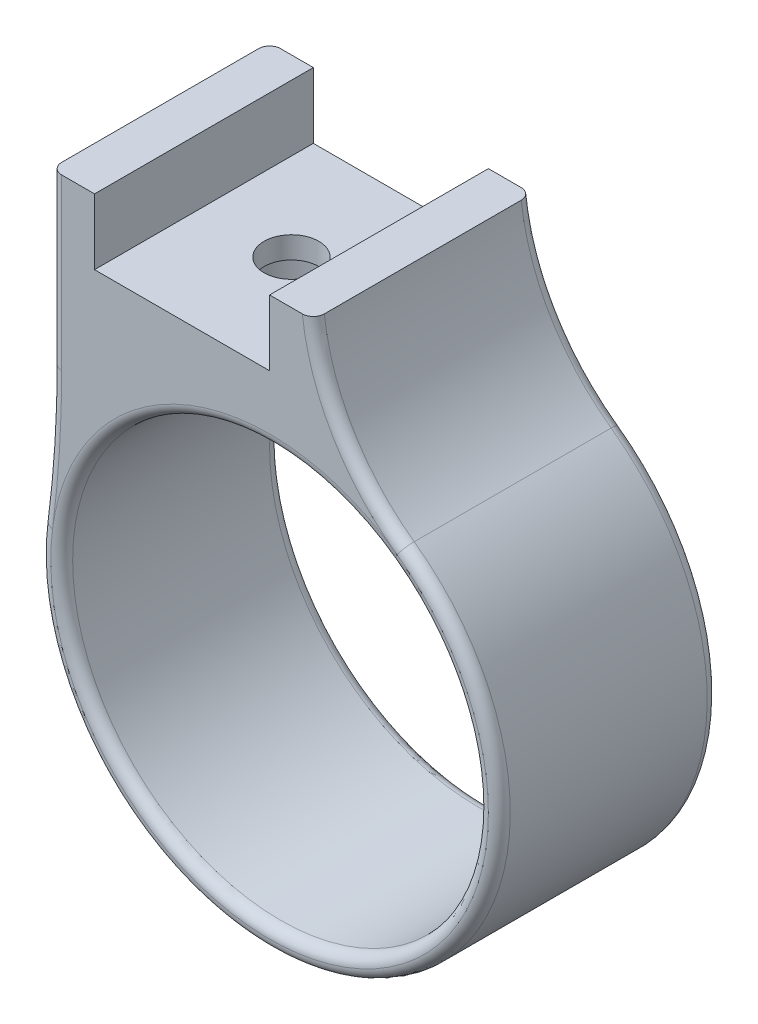
ISO-10303-21;
HEADER;
FILE_DESCRIPTION(('STEP AP214'),'2;1');
FILE_NAME('part.step','',(''),(''),'','','');
FILE_SCHEMA(('AUTOMOTIVE_DESIGN { 1 0 10303 214 1 1 1 1 }'));
ENDSEC;
DATA;
#1=APPLICATION_CONTEXT('core data for automotive mechanical design processes');
#2=APPLICATION_PROTOCOL_DEFINITION('international standard','automotive_design',2000,#1);
#3=PRODUCT_CONTEXT('',#1,'mechanical');
#4=PRODUCT('Part','Part','',(#3));
#5=PRODUCT_RELATED_PRODUCT_CATEGORY('part','',(#4));
#6=PRODUCT_DEFINITION_FORMATION('','',#4);
#7=PRODUCT_DEFINITION_CONTEXT('part definition',#1,'design');
#8=PRODUCT_DEFINITION('design','',#6,#7);
#9=PRODUCT_DEFINITION_SHAPE('','',#8);
#10=(LENGTH_UNIT() NAMED_UNIT(*) SI_UNIT(.MILLI.,.METRE.));
#11=(NAMED_UNIT(*) PLANE_ANGLE_UNIT() SI_UNIT($,.RADIAN.));
#12=(NAMED_UNIT(*) SI_UNIT($,.STERADIAN.) SOLID_ANGLE_UNIT());
#13=UNCERTAINTY_MEASURE_WITH_UNIT(LENGTH_MEASURE(1.E-05),#10,'distance_accuracy_value','');
#14=(GEOMETRIC_REPRESENTATION_CONTEXT(3) GLOBAL_UNCERTAINTY_ASSIGNED_CONTEXT((#13)) GLOBAL_UNIT_ASSIGNED_CONTEXT((#10,
#11,#12)) REPRESENTATION_CONTEXT('',''));
#15=CARTESIAN_POINT('',(0.,0.,0.));
#16=DIRECTION('',(0.,0.,1.));
#17=DIRECTION('',(1.,0.,0.));
#18=AXIS2_PLACEMENT_3D('',#15,#16,#17);
#19=CARTESIAN_POINT('',(0.,0.,10.));
#20=DIRECTION('',(0.,0.,-1.));
#21=DIRECTION('',(-1.,0.,0.));
#22=AXIS2_PLACEMENT_3D('',#19,#20,#21);
#23=CYLINDRICAL_SURFACE('',#22,9.5);
#24=CARTESIAN_POINT('',(0.,0.,9.5));
#25=DIRECTION('',(0.,0.,1.));
#26=DIRECTION('',(1.,0.,0.));
#27=AXIS2_PLACEMENT_3D('',#24,#25,#26);
#28=CIRCLE('',#27,9.5);
#29=CARTESIAN_POINT('',(9.5,0.,9.5));
#30=VERTEX_POINT('',#29);
#31=EDGE_CURVE('E55',#30,#30,#28,.T.);
#32=ORIENTED_EDGE('',*,*,#31,.T.);
#33=EDGE_LOOP('',(#32));
#34=FACE_BOUND('',#33,.T.);
#35=CARTESIAN_POINT('',(0.,0.,0.5));
#36=DIRECTION('',(0.,0.,1.));
#37=DIRECTION('',(1.,0.,0.));
#38=AXIS2_PLACEMENT_3D('',#35,#36,#37);
#39=CIRCLE('',#38,9.5);
#40=CARTESIAN_POINT('',(9.5,0.,0.5));
#41=VERTEX_POINT('',#40);
#42=EDGE_CURVE('E12',#41,#41,#39,.F.);
#43=ORIENTED_EDGE('',*,*,#42,.T.);
#44=EDGE_LOOP('',(#43));
#45=FACE_BOUND('',#44,.T.);
#46=CARTESIAN_POINT('',(-1.25,9.41740410091868,5.));
#47=CARTESIAN_POINT('',(-1.25000242942614,9.41740499517722,4.8471392243067));
#48=CARTESIAN_POINT('',(-1.2627801799666,9.41573453110463,4.69425180431218));
#49=CARTESIAN_POINT('',(-1.31352514631828,9.40878806358123,4.39276621787823));
#50=CARTESIAN_POINT('',(-1.35149964592117,9.40351101753854,4.24416930468956));
#51=CARTESIAN_POINT('',(-1.45149934047252,9.38859361920773,3.95550281859574));
#52=CARTESIAN_POINT('',(-1.51352756614653,9.37895271705608,3.81543432282976));
#53=CARTESIAN_POINT('',(-1.65967963332873,9.35419320402572,3.54788760394283));
#54=CARTESIAN_POINT('',(-1.74380079640655,9.33907525707058,3.42040785720493));
#55=CARTESIAN_POINT('',(-1.93092350382833,9.30218011409104,3.18224160698829));
#56=CARTESIAN_POINT('',(-2.0338335202413,9.28043487266991,3.07147825293275));
#57=CARTESIAN_POINT('',(-2.25527493712746,9.22911803105209,2.86905331392161));
#58=CARTESIAN_POINT('',(-2.37380473062673,9.19954723563895,2.77738976646479));
#59=CARTESIAN_POINT('',(-2.62192537839612,9.13191972864553,2.61561960292051));
#60=CARTESIAN_POINT('',(-2.7514759727179,9.09389314891011,2.545438494697));
#61=CARTESIAN_POINT('',(-3.01762299798536,9.00907614012515,2.4273276134396));
#62=CARTESIAN_POINT('',(-3.15421999503698,8.96228500613684,2.37939963131849));
#63=CARTESIAN_POINT('',(-3.43428005248692,8.85881723520026,2.30480448948951));
#64=CARTESIAN_POINT('',(-3.57782690233763,8.80189038542422,2.27880390405754));
#65=CARTESIAN_POINT('',(-3.86385602742951,8.68013910771712,2.24960747174418));
#66=CARTESIAN_POINT('',(-4.00633788213507,8.61531171860293,2.24642020237022));
#67=CARTESIAN_POINT('',(-4.29941272675105,8.4731257513436,2.26207068473277));
#68=CARTESIAN_POINT('',(-4.44960526553902,8.3951657645434,2.28288569143764));
#69=CARTESIAN_POINT('',(-4.74172530905777,8.23370798861784,2.34768868907996));
#70=CARTESIAN_POINT('',(-4.88365040665897,8.15020860163924,2.3916833918837));
#71=CARTESIAN_POINT('',(-5.17473347939294,7.96901420507636,2.5079810705976));
#72=CARTESIAN_POINT('',(-5.32244789450581,7.87088119269677,2.58321222201509));
#73=CARTESIAN_POINT('',(-5.60232462183589,7.67419344673526,2.75892282676735));
#74=CARTESIAN_POINT('',(-5.73445578215324,7.57563826333657,2.85945163603097));
#75=CARTESIAN_POINT('',(-5.92402033422029,7.42719331690365,3.0330702519432));
#76=CARTESIAN_POINT('',(-5.98800057109484,7.3756417307288,3.09771193215855));
#77=CARTESIAN_POINT('',(-6.11002804353712,7.274877156096,3.23402397066109));
#78=CARTESIAN_POINT('',(-6.1680734827941,7.225664878084,3.30569644420251));
#79=CARTESIAN_POINT('',(-6.3320478649435,7.08349099981838,3.53086284293945));
#80=CARTESIAN_POINT('',(-6.42845591791608,6.99547873205268,3.69508223965497));
#81=CARTESIAN_POINT('',(-6.55508932673793,6.87641414794421,3.97669687122736));
#82=CARTESIAN_POINT('',(-6.59624006673192,6.83680704450654,4.08566205520932));
#83=CARTESIAN_POINT('',(-6.66498491233125,6.76980576245483,4.31136824505659));
#84=CARTESIAN_POINT('',(-6.69259796013116,6.7423945241549,4.42809812500889));
#85=CARTESIAN_POINT('',(-6.73256732999249,6.70249065996649,4.66769936779907));
#86=CARTESIAN_POINT('',(-6.74480087448898,6.69011811651118,4.79061210716036));
#87=CARTESIAN_POINT('',(-6.75251262896919,6.68233596578608,5.03750346713367));
#88=CARTESIAN_POINT('',(-6.74799567700432,6.68692146051948,5.16148176965871));
#89=CARTESIAN_POINT('',(-6.72402945207496,6.71100941371279,5.39269228442336));
#90=CARTESIAN_POINT('',(-6.70624814322181,6.72884476725199,5.50028535620649));
#91=CARTESIAN_POINT('',(-6.65887545745454,6.77572746341205,5.71027185804691));
#92=CARTESIAN_POINT('',(-6.62927726321997,6.80478127779574,5.81266224810216));
#93=CARTESIAN_POINT('',(-6.54651684102347,6.88458549573622,6.04817921459132));
#94=CARTESIAN_POINT('',(-6.48867625637885,6.9393858242949,6.17828383109876));
#95=CARTESIAN_POINT('',(-6.356687317711,7.06049398701428,6.42410971956249));
#96=CARTESIAN_POINT('',(-6.28250219149629,7.12682769704027,6.53979762275179));
#97=CARTESIAN_POINT('',(-6.09602069372829,7.28751136757294,6.78889444149955));
#98=CARTESIAN_POINT('',(-5.97897151409784,7.384289006387,6.9171763927953));
#99=CARTESIAN_POINT('',(-5.72543648242841,7.5825688310675,7.14820937107058));
#100=CARTESIAN_POINT('',(-5.58893966870389,7.68407365955245,7.25094590907615));
#101=CARTESIAN_POINT('',(-5.29764456616094,7.88776912227569,7.43068143589357));
#102=CARTESIAN_POINT('',(-5.14266662756549,7.98995552620879,7.5073942664146));
#103=CARTESIAN_POINT('',(-4.81829029509524,8.18964079940366,7.63115105158259));
#104=CARTESIAN_POINT('',(-4.64889534411574,8.287140779166,7.67820206726441));
#105=CARTESIAN_POINT('',(-4.3859028570678,8.4275751472844,7.72427555804476));
#106=CARTESIAN_POINT('',(-4.29603713560976,8.4737455919423,7.73553909118393));
#107=CARTESIAN_POINT('',(-4.11434377817889,8.56343413119145,7.74912931418743));
#108=CARTESIAN_POINT('',(-4.02251716747022,8.60695356813883,7.75146056462163));
#109=CARTESIAN_POINT('',(-3.83775107481048,8.69091286545009,7.7467641521344));
#110=CARTESIAN_POINT('',(-3.74481214972662,8.73135419785879,7.73974099288959));
#111=CARTESIAN_POINT('',(-3.5587523743861,8.80882668049014,7.71598788876548));
#112=CARTESIAN_POINT('',(-3.46563156132805,8.84585846588441,7.69925975610261));
#113=CARTESIAN_POINT('',(-3.29229554848402,8.91169155828491,7.65866945548362));
#114=CARTESIAN_POINT('',(-3.21196696449857,8.94093813413205,7.63600781925485));
#115=CARTESIAN_POINT('',(-3.05282183959244,8.99652047184373,7.58309575378409));
#116=CARTESIAN_POINT('',(-2.97400507643748,9.02285666428044,7.55284644925895));
#117=CARTESIAN_POINT('',(-2.81876131443948,9.07255318495519,7.48482362876756));
#118=CARTESIAN_POINT('',(-2.74233298670707,9.09591519105757,7.44705438622973));
#119=CARTESIAN_POINT('',(-2.59270966428482,9.13969063683839,7.36418270269511));
#120=CARTESIAN_POINT('',(-2.51951439071886,9.16010433117786,7.31908089576621));
#121=CARTESIAN_POINT('',(-2.32168041620334,9.21286688326707,7.18385179033027));
#122=CARTESIAN_POINT('',(-2.20136112480906,9.24213300231458,7.08600956154516));
#123=CARTESIAN_POINT('',(-1.97815345982823,9.29247403007962,6.87049030343174));
#124=CARTESIAN_POINT('',(-1.8752624646644,9.31355017135803,6.75281626254127));
#125=CARTESIAN_POINT('',(-1.69370108656971,9.34824257297877,6.50539562121783));
#126=CARTESIAN_POINT('',(-1.61432077387448,9.3620899860072,6.37620180195469));
#127=CARTESIAN_POINT('',(-1.47775747425183,9.384617782292,6.10619705412071));
#128=CARTESIAN_POINT('',(-1.42056815666641,9.39329963955816,5.96538945265532));
#129=CARTESIAN_POINT('',(-1.33390304160166,9.40597969607959,5.6882690120222));
#130=CARTESIAN_POINT('',(-1.30250747252459,9.41030923767995,5.55256725796968));
#131=CARTESIAN_POINT('',(-1.26055454106607,9.41602107692763,5.27791774010017));
#132=CARTESIAN_POINT('',(-1.24999779134274,9.41740328792397,5.1389698809697));
#133=CARTESIAN_POINT('',(-1.25,9.41740410091868,5.));
#134=B_SPLINE_CURVE_WITH_KNOTS('',3,(#46,#47,#48,#49,#50,#51,#52,#53,#54,#55,#56,#57,#58,#59,
#60,#61,#62,#63,#64,#65,#66,#67,#68,#69,#70,#71,#72,#73,#74,#75,#76,#77,#78,#79,#80,#81,#82,#83,
#84,#85,#86,#87,#88,#89,#90,#91,#92,#93,#94,#95,#96,#97,#98,#99,#100,#101,#102,#103,#104,#105,
#106,#107,#108,#109,#110,#111,#112,#113,#114,#115,#116,#117,#118,#119,#120,#121,#122,#123,#124,
#125,#126,#127,#128,#129,#130,#131,#132,#133),.UNSPECIFIED.,.T.,.F.,(4,2,2,2,2,2,2,2,2,2,2,2,2,
2,2,2,2,2,2,2,2,2,2,2,2,2,2,2,2,2,2,2,2,2,2,2,2,2,2,2,2,2,2,4),(0.,0.458089417631885,
0.916311315942006,1.37459096814315,1.83281508657986,2.28886384807874,2.74486572752839,
3.19926798643603,3.6537068089171,4.12150762497535,4.5894843187663,5.09894069678951,
5.60854467311717,6.184144060842,6.7608752741334,7.07410826645905,7.38743578743586,
8.01112208899272,8.37893606678823,8.74623391296586,9.11644572490009,9.48655061676391,
9.8166239789587,10.1468880407289,10.6020646983916,11.0582760709452,11.6516272226566,
12.2453141504566,12.8453323634451,13.4452076873026,13.7498142261621,14.0542652208334,
14.3585696906711,14.6628173558042,14.9277674388166,15.1926782715751,15.4574389883629,
15.722176822697,16.1930436525199,16.6638395911846,17.1184813859305,17.5729933847172,
17.9894426669023,18.4059041924509),.UNSPECIFIED.);
#135=CARTESIAN_POINT('',(-1.25,9.41740410091868,5.));
#136=VERTEX_POINT('',#135);
#137=EDGE_CURVE('E45',#136,#136,#134,.T.);
#138=ORIENTED_EDGE('',*,*,#137,.T.);
#139=EDGE_LOOP('',(#138));
#140=FACE_BOUND('',#139,.T.);
#141=ADVANCED_FACE('F41',(#34,#45,#140),#23,.F.);
#142=CARTESIAN_POINT('',(-10.,0.,10.));
#143=DIRECTION('',(1.,0.,0.));
#144=DIRECTION('',(0.,1.,0.));
#145=AXIS2_PLACEMENT_3D('',#142,#143,#144);
#146=PLANE('',#145);
#147=DIRECTION('',(0.,0.,-1.));
#148=VECTOR('',#147,1.);
#149=CARTESIAN_POINT('',(-10.,15.5,10.));
#150=LINE('',#149,#148);
#151=CARTESIAN_POINT('',(-10.,15.5,9.5));
#152=VERTEX_POINT('',#151);
#153=CARTESIAN_POINT('',(-10.,15.5,0.5));
#154=VERTEX_POINT('',#153);
#155=EDGE_CURVE('E187',#152,#154,#150,.T.);
#156=ORIENTED_EDGE('',*,*,#155,.T.);
#157=DIRECTION('',(0.,-1.,0.));
#158=VECTOR('',#157,1.);
#159=CARTESIAN_POINT('',(-10.,0.,0.5));
#160=LINE('',#159,#158);
#161=CARTESIAN_POINT('',(-9.99999999999999,7.76208734813006,0.5));
#162=VERTEX_POINT('',#161);
#163=EDGE_CURVE('E216',#154,#162,#160,.T.);
#164=ORIENTED_EDGE('',*,*,#163,.T.);
#165=DIRECTION('',(0.,0.,1.));
#166=VECTOR('',#165,1.);
#167=CARTESIAN_POINT('',(-9.99999999999999,7.76208734813006,10.));
#168=LINE('',#167,#166);
#169=CARTESIAN_POINT('',(-9.99999999999999,7.76208734813006,9.5));
#170=VERTEX_POINT('',#169);
#171=EDGE_CURVE('E208',#162,#170,#168,.T.);
#172=ORIENTED_EDGE('',*,*,#171,.T.);
#173=DIRECTION('',(0.,-1.,0.));
#174=VECTOR('',#173,1.);
#175=CARTESIAN_POINT('',(-10.,15.5,9.5));
#176=LINE('',#175,#174);
#177=EDGE_CURVE('E214',#170,#152,#176,.F.);
#178=ORIENTED_EDGE('',*,*,#177,.T.);
#179=EDGE_LOOP('',(#156,#164,#172,#178));
#180=FACE_BOUND('',#179,.T.);
#181=ADVANCED_FACE('F313',(#180),#146,.F.);
#182=CARTESIAN_POINT('',(0.,0.,10.));
#183=DIRECTION('',(0.,0.,-1.));
#184=DIRECTION('',(-1.,0.,0.));
#185=AXIS2_PLACEMENT_3D('',#182,#183,#184);
#186=CYLINDRICAL_SURFACE('',#185,10.5);
#187=DIRECTION('',(0.,0.,-1.));
#188=VECTOR('',#187,1.);
#189=CARTESIAN_POINT('',(-10.4132231404959,1.34713912653497,10.));
#190=LINE('',#189,#188);
#191=CARTESIAN_POINT('',(-10.4132231404959,1.34713912653497,9.5));
#192=VERTEX_POINT('',#191);
#193=CARTESIAN_POINT('',(-10.4132231404959,1.34713912653497,0.5));
#194=VERTEX_POINT('',#193);
#195=EDGE_CURVE('E205',#192,#194,#190,.T.);
#196=ORIENTED_EDGE('',*,*,#195,.T.);
#197=CARTESIAN_POINT('',(0.,0.,0.5));
#198=DIRECTION('',(0.,0.,1.));
#199=DIRECTION('',(1.,0.,0.));
#200=AXIS2_PLACEMENT_3D('',#197,#198,#199);
#201=CIRCLE('',#200,10.5);
#202=CARTESIAN_POINT('',(6.11115412890951,8.53837192986533,0.5));
#203=VERTEX_POINT('',#202);
#204=EDGE_CURVE('E237',#194,#203,#201,.T.);
#205=ORIENTED_EDGE('',*,*,#204,.T.);
#206=DIRECTION('',(0.,0.,-1.));
#207=VECTOR('',#206,1.);
#208=CARTESIAN_POINT('',(6.11115412890951,8.53837192986533,10.));
#209=LINE('',#208,#207);
#210=CARTESIAN_POINT('',(6.11115412890951,8.53837192986533,9.5));
#211=VERTEX_POINT('',#210);
#212=EDGE_CURVE('E211',#203,#211,#209,.F.);
#213=ORIENTED_EDGE('',*,*,#212,.T.);
#214=CARTESIAN_POINT('',(0.,0.,9.5));
#215=DIRECTION('',(0.,0.,1.));
#216=DIRECTION('',(1.,0.,0.));
#217=AXIS2_PLACEMENT_3D('',#214,#215,#216);
#218=CIRCLE('',#217,10.5);
#219=EDGE_CURVE('E235',#211,#192,#218,.F.);
#220=ORIENTED_EDGE('',*,*,#219,.T.);
#221=EDGE_LOOP('',(#196,#205,#213,#220));
#222=FACE_BOUND('',#221,.T.);
#223=ADVANCED_FACE('F315',(#222),#186,.T.);
#224=CARTESIAN_POINT('',(0.,15.5,10.));
#225=DIRECTION('',(0.,1.,0.));
#226=DIRECTION('',(-1.,0.,0.));
#227=AXIS2_PLACEMENT_3D('',#224,#225,#226);
#228=PLANE('',#227);
#229=DIRECTION('',(0.,0.,-1.));
#230=VECTOR('',#229,1.);
#231=CARTESIAN_POINT('',(2.,15.5,10.));
#232=LINE('',#231,#230);
#233=CARTESIAN_POINT('',(2.,15.5,9.5));
#234=VERTEX_POINT('',#233);
#235=CARTESIAN_POINT('',(2.,15.5,0.5));
#236=VERTEX_POINT('',#235);
#237=EDGE_CURVE('E158',#234,#236,#232,.T.);
#238=ORIENTED_EDGE('',*,*,#237,.T.);
#239=CARTESIAN_POINT('',(2.,15.5,0.5));
#240=CARTESIAN_POINT('',(2.00002473609753,15.5,0.472008682119492));
#241=CARTESIAN_POINT('',(1.99763471102162,15.5,0.444025704111501));
#242=CARTESIAN_POINT('',(1.98820912201837,15.5,0.388880529609376));
#243=CARTESIAN_POINT('',(1.98117814148568,15.5,0.361717550935805));
#244=CARTESIAN_POINT('',(1.96265016368242,15.5,0.308947390245673));
#245=CARTESIAN_POINT('',(1.95115133588573,15.5,0.283340850898684));
#246=CARTESIAN_POINT('',(1.92403414552291,15.5,0.234416426620132));
#247=CARTESIAN_POINT('',(1.90841627164685,15.5,0.21109827064119));
#248=CARTESIAN_POINT('',(1.87345570261965,15.5,0.167326374144017));
#249=CARTESIAN_POINT('',(1.85410159020956,15.5,0.146881754322357));
#250=CARTESIAN_POINT('',(1.81225120899074,15.5,0.109502691610811));
#251=CARTESIAN_POINT('',(1.78975428287494,15.5,0.0925689848597146));
#252=CARTESIAN_POINT('',(1.74210331764564,15.5,0.0625791749458284));
#253=CARTESIAN_POINT('',(1.71693268168432,15.5,0.0495494708919888));
#254=CARTESIAN_POINT('',(1.66477403436174,15.5,0.0278795337881616));
#255=CARTESIAN_POINT('',(1.63778693830127,15.5,0.0192371084990511));
#256=CARTESIAN_POINT('',(1.59166239597968,15.5,0.00861628308842245));
#257=CARTESIAN_POINT('',(1.57280316836436,15.5,0.00538727106598585));
#258=CARTESIAN_POINT('',(1.53486766889151,15.5,0.00107930959514007));
#259=CARTESIAN_POINT('',(1.51579173970835,15.5,-2.65826989402645E-06));
#260=CARTESIAN_POINT('',(1.49670758986698,15.5,0.));
#261=B_SPLINE_CURVE_WITH_KNOTS('',3,(#239,#240,#241,#242,#243,#244,#245,#246,#247,#248,#249,
#250,#251,#252,#253,#254,#255,#256,#257,#258,#259,#260),.UNSPECIFIED.,.F.,.F.,(4,2,2,2,2,2,2,2,
2,2,4),(0.,0.083859923714983,0.167637151270413,0.251448739532019,0.33525038872528,
0.419312294272436,0.503391807429978,0.588027665889565,0.672621191702053,0.729907622443254,
0.787113459982348),.UNSPECIFIED.);
#262=CARTESIAN_POINT('',(1.49670758986698,15.5,0.));
#263=VERTEX_POINT('',#262);
#264=EDGE_CURVE('E256',#236,#263,#261,.T.);
#265=ORIENTED_EDGE('',*,*,#264,.T.);
#266=DIRECTION('',(1.,0.,0.));
#267=VECTOR('',#266,1.);
#268=CARTESIAN_POINT('',(0.,15.5,0.));
#269=LINE('',#268,#267);
#270=CARTESIAN_POINT('',(0.,15.5,0.));
#271=VERTEX_POINT('',#270);
#272=EDGE_CURVE('E155',#271,#263,#269,.T.);
#273=ORIENTED_EDGE('',*,*,#272,.F.);
#274=DIRECTION('',(0.,0.,-1.));
#275=VECTOR('',#274,1.);
#276=CARTESIAN_POINT('',(0.,15.5,10.));
#277=LINE('',#276,#275);
#278=CARTESIAN_POINT('',(0.,15.5,10.));
#279=VERTEX_POINT('',#278);
#280=EDGE_CURVE('E149',#279,#271,#277,.T.);
#281=ORIENTED_EDGE('',*,*,#280,.F.);
#282=DIRECTION('',(1.,0.,0.));
#283=VECTOR('',#282,1.);
#284=CARTESIAN_POINT('',(0.,15.5,10.));
#285=LINE('',#284,#283);
#286=CARTESIAN_POINT('',(1.49670758986698,15.5,10.));
#287=VERTEX_POINT('',#286);
#288=EDGE_CURVE('E153',#279,#287,#285,.T.);
#289=ORIENTED_EDGE('',*,*,#288,.T.);
#290=CARTESIAN_POINT('',(1.49670758986698,15.5,10.));
#291=CARTESIAN_POINT('',(1.525153713205,15.5,10.0000232337651));
#292=CARTESIAN_POINT('',(1.55359347651729,15.5,9.99760396339556));
#293=CARTESIAN_POINT('',(1.60965323071159,15.5,9.988052355082));
#294=CARTESIAN_POINT('',(1.63727371311941,15.5,9.98092290530754));
#295=CARTESIAN_POINT('',(1.69093884396039,15.5,9.96211751427752));
#296=CARTESIAN_POINT('',(1.71698265025888,15.5,9.95043916769151));
#297=CARTESIAN_POINT('',(1.76672810789301,15.5,9.92286874119319));
#298=CARTESIAN_POINT('',(1.79043027529278,15.5,9.9069775925793));
#299=CARTESIAN_POINT('',(1.83475441980384,15.5,9.87146772344449));
#300=CARTESIAN_POINT('',(1.85538423730701,15.5,9.85185879188598));
#301=CARTESIAN_POINT('',(1.89303859415014,15.5,9.80943188939347));
#302=CARTESIAN_POINT('',(1.91006247994112,15.5,9.78661333798408));
#303=CARTESIAN_POINT('',(1.93990588297583,15.5,9.7385662790271));
#304=CARTESIAN_POINT('',(1.95274979371537,15.5,9.71335290527966));
#305=CARTESIAN_POINT('',(1.97398485534625,15.5,9.66112424212973));
#306=CARTESIAN_POINT('',(1.98237904766596,15.5,9.63411019775826));
#307=CARTESIAN_POINT('',(1.99227204399437,15.5,9.58909419910003));
#308=CARTESIAN_POINT('',(1.99516827678685,15.5,9.57138710104998));
#309=CARTESIAN_POINT('',(1.99903191404174,15.5,9.53578927414797));
#310=CARTESIAN_POINT('',(2.00000205733035,15.5,9.51789884245437));
#311=CARTESIAN_POINT('',(2.,15.5,9.5));
#312=B_SPLINE_CURVE_WITH_KNOTS('',3,(#290,#291,#292,#293,#294,#295,#296,#297,#298,#299,#300,
#301,#302,#303,#304,#305,#306,#307,#308,#309,#310,#311),.UNSPECIFIED.,.F.,.F.,(4,2,2,2,2,2,2,2,
2,2,4),(0.,0.0852267672747665,0.170401323973741,0.255620979889486,0.340821812502985,
0.425801349891418,0.510796276051281,0.595285903118786,0.679717705949154,0.733448028569315,
0.787101893831302),.UNSPECIFIED.);
#313=EDGE_CURVE('E70',#287,#234,#312,.T.);
#314=ORIENTED_EDGE('',*,*,#313,.T.);
#315=EDGE_LOOP('',(#238,#265,#273,#281,#289,#314));
#316=FACE_BOUND('',#315,.T.);
#317=ADVANCED_FACE('F151',(#316),#228,.T.);
#318=CARTESIAN_POINT('',(0.,0.,10.));
#319=DIRECTION('',(1.,0.,0.));
#320=DIRECTION('',(0.,1.,0.));
#321=AXIS2_PLACEMENT_3D('',#318,#319,#320);
#322=PLANE('',#321);
#323=DIRECTION('',(0.,-1.,0.));
#324=VECTOR('',#323,1.);
#325=CARTESIAN_POINT('',(0.,0.,0.));
#326=LINE('',#325,#324);
#327=CARTESIAN_POINT('',(0.,12.5,0.));
#328=VERTEX_POINT('',#327);
#329=EDGE_CURVE('E189',#271,#328,#326,.T.);
#330=ORIENTED_EDGE('',*,*,#329,.T.);
#331=DIRECTION('',(0.,0.,-1.));
#332=VECTOR('',#331,1.);
#333=CARTESIAN_POINT('',(0.,12.5,10.));
#334=LINE('',#333,#332);
#335=CARTESIAN_POINT('',(0.,12.5,10.));
#336=VERTEX_POINT('',#335);
#337=EDGE_CURVE('E159',#336,#328,#334,.T.);
#338=ORIENTED_EDGE('',*,*,#337,.F.);
#339=DIRECTION('',(0.,-1.,0.));
#340=VECTOR('',#339,1.);
#341=CARTESIAN_POINT('',(0.,0.,10.));
#342=LINE('',#341,#340);
#343=EDGE_CURVE('E162',#279,#336,#342,.T.);
#344=ORIENTED_EDGE('',*,*,#343,.F.);
#345=ORIENTED_EDGE('',*,*,#280,.T.);
#346=EDGE_LOOP('',(#330,#338,#344,#345));
#347=FACE_BOUND('',#346,.T.);
#348=ADVANCED_FACE('F163',(#347),#322,.F.);
#349=CARTESIAN_POINT('',(0.,12.5,10.));
#350=DIRECTION('',(0.,-1.,0.));
#351=DIRECTION('',(1.,0.,0.));
#352=AXIS2_PLACEMENT_3D('',#349,#350,#351);
#353=PLANE('',#352);
#354=CARTESIAN_POINT('',(-4.,12.5,5.));
#355=DIRECTION('',(0.,1.,0.));
#356=DIRECTION('',(0.,0.,1.));
#357=AXIS2_PLACEMENT_3D('',#354,#355,#356);
#358=CIRCLE('',#357,1.25);
#359=CARTESIAN_POINT('',(-4.,12.5,6.25));
#360=VERTEX_POINT('',#359);
#361=EDGE_CURVE('E178',#360,#360,#358,.T.);
#362=ORIENTED_EDGE('',*,*,#361,.F.);
#363=EDGE_LOOP('',(#362));
#364=FACE_BOUND('',#363,.T.);
#365=DIRECTION('',(-1.,0.,0.));
#366=VECTOR('',#365,1.);
#367=CARTESIAN_POINT('',(0.,12.5,0.));
#368=LINE('',#367,#366);
#369=CARTESIAN_POINT('',(-8.,12.5,0.));
#370=VERTEX_POINT('',#369);
#371=EDGE_CURVE('E191',#328,#370,#368,.T.);
#372=ORIENTED_EDGE('',*,*,#371,.T.);
#373=DIRECTION('',(0.,0.,-1.));
#374=VECTOR('',#373,1.);
#375=CARTESIAN_POINT('',(-8.,12.5,10.));
#376=LINE('',#375,#374);
#377=CARTESIAN_POINT('',(-8.,12.5,10.));
#378=VERTEX_POINT('',#377);
#379=EDGE_CURVE('E201',#378,#370,#376,.T.);
#380=ORIENTED_EDGE('',*,*,#379,.F.);
#381=DIRECTION('',(-1.,0.,0.));
#382=VECTOR('',#381,1.);
#383=CARTESIAN_POINT('',(0.,12.5,10.));
#384=LINE('',#383,#382);
#385=EDGE_CURVE('E167',#336,#378,#384,.T.);
#386=ORIENTED_EDGE('',*,*,#385,.F.);
#387=ORIENTED_EDGE('',*,*,#337,.T.);
#388=EDGE_LOOP('',(#372,#380,#386,#387));
#389=FACE_BOUND('',#388,.T.);
#390=ADVANCED_FACE('F339',(#364,#389),#353,.F.);
#391=CARTESIAN_POINT('',(-8.,0.,10.));
#392=DIRECTION('',(1.,0.,0.));
#393=DIRECTION('',(0.,0.,-1.));
#394=AXIS2_PLACEMENT_3D('',#391,#392,#393);
#395=PLANE('',#394);
#396=DIRECTION('',(0.,-1.,0.));
#397=VECTOR('',#396,1.);
#398=CARTESIAN_POINT('',(-8.,0.,0.));
#399=LINE('',#398,#397);
#400=CARTESIAN_POINT('',(-8.,15.5,0.));
#401=VERTEX_POINT('',#400);
#402=EDGE_CURVE('E175',#401,#370,#399,.T.);
#403=ORIENTED_EDGE('',*,*,#402,.F.);
#404=DIRECTION('',(0.,0.,-1.));
#405=VECTOR('',#404,1.);
#406=CARTESIAN_POINT('',(-8.,15.5,10.));
#407=LINE('',#406,#405);
#408=CARTESIAN_POINT('',(-8.,15.5,10.));
#409=VERTEX_POINT('',#408);
#410=EDGE_CURVE('E198',#409,#401,#407,.T.);
#411=ORIENTED_EDGE('',*,*,#410,.F.);
#412=DIRECTION('',(0.,-1.,0.));
#413=VECTOR('',#412,1.);
#414=CARTESIAN_POINT('',(-8.,0.,10.));
#415=LINE('',#414,#413);
#416=EDGE_CURVE('E182',#409,#378,#415,.T.);
#417=ORIENTED_EDGE('',*,*,#416,.T.);
#418=ORIENTED_EDGE('',*,*,#379,.T.);
#419=EDGE_LOOP('',(#403,#411,#417,#418));
#420=FACE_BOUND('',#419,.T.);
#421=ADVANCED_FACE('F335',(#420),#395,.T.);
#422=CARTESIAN_POINT('',(0.,15.5,10.));
#423=DIRECTION('',(0.,1.,0.));
#424=DIRECTION('',(0.,0.,1.));
#425=AXIS2_PLACEMENT_3D('',#422,#423,#424);
#426=PLANE('',#425);
#427=DIRECTION('',(1.,0.,0.));
#428=VECTOR('',#427,1.);
#429=CARTESIAN_POINT('',(0.,15.5,0.));
#430=LINE('',#429,#428);
#431=CARTESIAN_POINT('',(-9.5,15.5,0.));
#432=VERTEX_POINT('',#431);
#433=EDGE_CURVE('E173',#432,#401,#430,.T.);
#434=ORIENTED_EDGE('',*,*,#433,.F.);
#435=CARTESIAN_POINT('',(-9.5,15.5,0.5));
#436=DIRECTION('',(0.,1.,0.));
#437=DIRECTION('',(0.,0.,1.));
#438=AXIS2_PLACEMENT_3D('',#435,#436,#437);
#439=CIRCLE('',#438,0.5);
#440=EDGE_CURVE('E229',#432,#154,#439,.T.);
#441=ORIENTED_EDGE('',*,*,#440,.T.);
#442=ORIENTED_EDGE('',*,*,#155,.F.);
#443=CARTESIAN_POINT('',(-9.5,15.5,9.5));
#444=DIRECTION('',(0.,1.,0.));
#445=DIRECTION('',(0.,0.,1.));
#446=AXIS2_PLACEMENT_3D('',#443,#444,#445);
#447=CIRCLE('',#446,0.5);
#448=CARTESIAN_POINT('',(-9.5,15.5,10.));
#449=VERTEX_POINT('',#448);
#450=EDGE_CURVE('E227',#152,#449,#447,.T.);
#451=ORIENTED_EDGE('',*,*,#450,.T.);
#452=DIRECTION('',(1.,0.,0.));
#453=VECTOR('',#452,1.);
#454=CARTESIAN_POINT('',(0.,15.5,10.));
#455=LINE('',#454,#453);
#456=EDGE_CURVE('E185',#449,#409,#455,.T.);
#457=ORIENTED_EDGE('',*,*,#456,.T.);
#458=ORIENTED_EDGE('',*,*,#410,.T.);
#459=EDGE_LOOP('',(#434,#441,#442,#451,#457,#458));
#460=FACE_BOUND('',#459,.T.);
#461=ADVANCED_FACE('F332',(#460),#426,.T.);
#462=CARTESIAN_POINT('',(0.,0.,10.));
#463=DIRECTION('',(0.,0.,1.));
#464=DIRECTION('',(1.,0.,0.));
#465=AXIS2_PLACEMENT_3D('',#462,#463,#464);
#466=PLANE('',#465);
#467=ORIENTED_EDGE('',*,*,#456,.F.);
#468=DIRECTION('',(0.,-1.,0.));
#469=VECTOR('',#468,1.);
#470=CARTESIAN_POINT('',(-9.5,7.76208734813006,10.));
#471=LINE('',#470,#469);
#472=CARTESIAN_POINT('',(-9.49999999999999,7.76208734813006,10.));
#473=VERTEX_POINT('',#472);
#474=EDGE_CURVE('E244',#449,#473,#471,.T.);
#475=ORIENTED_EDGE('',*,*,#474,.T.);
#476=CARTESIAN_POINT('',(-60.,7.76208734813006,10.));
#477=DIRECTION('',(0.,0.,1.));
#478=DIRECTION('',(1.,0.,0.));
#479=AXIS2_PLACEMENT_3D('',#476,#477,#478);
#480=CIRCLE('',#479,50.5);
#481=CARTESIAN_POINT('',(-9.91735537190083,1.28298964431902,10.));
#482=VERTEX_POINT('',#481);
#483=EDGE_CURVE('E242',#473,#482,#480,.F.);
#484=ORIENTED_EDGE('',*,*,#483,.T.);
#485=CARTESIAN_POINT('',(0.,0.,10.));
#486=DIRECTION('',(0.,0.,1.));
#487=DIRECTION('',(1.,0.,0.));
#488=AXIS2_PLACEMENT_3D('',#485,#486,#487);
#489=CIRCLE('',#488,10.);
#490=CARTESIAN_POINT('',(5.82014678943763,8.13178279034794,10.));
#491=VERTEX_POINT('',#490);
#492=EDGE_CURVE('E239',#482,#491,#489,.F.);
#493=ORIENTED_EDGE('',*,*,#492,.T.);
#494=CARTESIAN_POINT('',(11.9313009183471,16.6701547202133,10.));
#495=DIRECTION('',(0.,0.,1.));
#496=DIRECTION('',(1.,0.,0.));
#497=AXIS2_PLACEMENT_3D('',#494,#495,#496);
#498=CIRCLE('',#497,10.5);
#499=EDGE_CURVE('E172',#491,#287,#498,.F.);
#500=ORIENTED_EDGE('',*,*,#499,.T.);
#501=ORIENTED_EDGE('',*,*,#288,.F.);
#502=ORIENTED_EDGE('',*,*,#343,.T.);
#503=ORIENTED_EDGE('',*,*,#385,.T.);
#504=ORIENTED_EDGE('',*,*,#416,.F.);
#505=EDGE_LOOP('',(#467,#475,#484,#493,#500,#501,#502,#503,#504));
#506=FACE_BOUND('',#505,.T.);
#507=ADVANCED_FACE('F170',(#506),#466,.T.);
#508=CARTESIAN_POINT('',(0.,0.,0.));
#509=DIRECTION('',(0.,0.,1.));
#510=DIRECTION('',(1.,0.,0.));
#511=AXIS2_PLACEMENT_3D('',#508,#509,#510);
#512=PLANE('',#511);
#513=CARTESIAN_POINT('',(-60.,7.76208734813006,0.));
#514=DIRECTION('',(0.,0.,1.));
#515=DIRECTION('',(1.,0.,0.));
#516=AXIS2_PLACEMENT_3D('',#513,#514,#515);
#517=CIRCLE('',#516,50.5);
#518=CARTESIAN_POINT('',(-9.91735537190083,1.28298964431902,0.));
#519=VERTEX_POINT('',#518);
#520=CARTESIAN_POINT('',(-9.5,7.76208734813006,0.));
#521=VERTEX_POINT('',#520);
#522=EDGE_CURVE('E223',#519,#521,#517,.T.);
#523=ORIENTED_EDGE('',*,*,#522,.T.);
#524=DIRECTION('',(0.,-1.,0.));
#525=VECTOR('',#524,1.);
#526=CARTESIAN_POINT('',(-9.5,0.,0.));
#527=LINE('',#526,#525);
#528=EDGE_CURVE('E225',#521,#432,#527,.F.);
#529=ORIENTED_EDGE('',*,*,#528,.T.);
#530=ORIENTED_EDGE('',*,*,#433,.T.);
#531=ORIENTED_EDGE('',*,*,#402,.T.);
#532=ORIENTED_EDGE('',*,*,#371,.F.);
#533=ORIENTED_EDGE('',*,*,#329,.F.);
#534=ORIENTED_EDGE('',*,*,#272,.T.);
#535=CARTESIAN_POINT('',(11.9313009183471,16.6701547202133,0.));
#536=DIRECTION('',(0.,0.,1.));
#537=DIRECTION('',(1.,0.,0.));
#538=AXIS2_PLACEMENT_3D('',#535,#536,#537);
#539=CIRCLE('',#538,10.5);
#540=CARTESIAN_POINT('',(5.82014678943763,8.13178279034794,0.));
#541=VERTEX_POINT('',#540);
#542=EDGE_CURVE('E221',#263,#541,#539,.T.);
#543=ORIENTED_EDGE('',*,*,#542,.T.);
#544=CARTESIAN_POINT('',(0.,0.,0.));
#545=DIRECTION('',(0.,0.,1.));
#546=DIRECTION('',(1.,0.,0.));
#547=AXIS2_PLACEMENT_3D('',#544,#545,#546);
#548=CIRCLE('',#547,10.);
#549=EDGE_CURVE('E219',#541,#519,#548,.T.);
#550=ORIENTED_EDGE('',*,*,#549,.T.);
#551=EDGE_LOOP('',(#523,#529,#530,#531,#532,#533,#534,#543,#550));
#552=FACE_BOUND('',#551,.T.);
#553=ADVANCED_FACE('F311',(#552),#512,.F.);
#554=CARTESIAN_POINT('',(-60.,7.76208734813006,10.));
#555=DIRECTION('',(0.,0.,-1.));
#556=DIRECTION('',(-1.,0.,0.));
#557=AXIS2_PLACEMENT_3D('',#554,#555,#556);
#558=CYLINDRICAL_SURFACE('',#557,50.);
#559=ORIENTED_EDGE('',*,*,#171,.F.);
#560=CARTESIAN_POINT('',(-60.,7.76208734813006,0.5));
#561=DIRECTION('',(0.,0.,1.));
#562=DIRECTION('',(1.,0.,0.));
#563=AXIS2_PLACEMENT_3D('',#560,#561,#562);
#564=CIRCLE('',#563,50.);
#565=EDGE_CURVE('E233',#162,#194,#564,.F.);
#566=ORIENTED_EDGE('',*,*,#565,.T.);
#567=ORIENTED_EDGE('',*,*,#195,.F.);
#568=CARTESIAN_POINT('',(-60.,7.76208734813006,9.5));
#569=DIRECTION('',(0.,0.,1.));
#570=DIRECTION('',(1.,0.,0.));
#571=AXIS2_PLACEMENT_3D('',#568,#569,#570);
#572=CIRCLE('',#571,50.);
#573=EDGE_CURVE('E231',#192,#170,#572,.T.);
#574=ORIENTED_EDGE('',*,*,#573,.T.);
#575=EDGE_LOOP('',(#559,#566,#567,#574));
#576=FACE_BOUND('',#575,.T.);
#577=ADVANCED_FACE('F308',(#576),#558,.F.);
#578=CARTESIAN_POINT('',(11.9313009183471,16.6701547202133,10.));
#579=DIRECTION('',(0.,0.,1.));
#580=DIRECTION('',(1.,0.,0.));
#581=AXIS2_PLACEMENT_3D('',#578,#579,#580);
#582=CYLINDRICAL_SURFACE('',#581,10.);
#583=ORIENTED_EDGE('',*,*,#212,.F.);
#584=CARTESIAN_POINT('',(11.9313009183471,16.6701547202133,0.5));
#585=DIRECTION('',(0.,0.,1.));
#586=DIRECTION('',(1.,0.,0.));
#587=AXIS2_PLACEMENT_3D('',#584,#585,#586);
#588=CIRCLE('',#587,10.);
#589=EDGE_CURVE('E63',#203,#236,#588,.F.);
#590=ORIENTED_EDGE('',*,*,#589,.T.);
#591=ORIENTED_EDGE('',*,*,#237,.F.);
#592=CARTESIAN_POINT('',(11.9313009183471,16.6701547202133,9.5));
#593=DIRECTION('',(0.,0.,1.));
#594=DIRECTION('',(1.,0.,0.));
#595=AXIS2_PLACEMENT_3D('',#592,#593,#594);
#596=CIRCLE('',#595,10.);
#597=EDGE_CURVE('E247',#234,#211,#596,.T.);
#598=ORIENTED_EDGE('',*,*,#597,.T.);
#599=EDGE_LOOP('',(#583,#590,#591,#598));
#600=FACE_BOUND('',#599,.T.);
#601=ADVANCED_FACE('F305',(#600),#582,.F.);
#602=CARTESIAN_POINT('',(-4.,12.5,5.));
#603=DIRECTION('',(0.,1.,0.));
#604=DIRECTION('',(0.,0.,1.));
#605=AXIS2_PLACEMENT_3D('',#602,#603,#604);
#606=CYLINDRICAL_SURFACE('',#605,1.25);
#607=CARTESIAN_POINT('',(-4.,11.5,5.));
#608=DIRECTION('',(0.,1.,0.));
#609=DIRECTION('',(-1.,0.,0.));
#610=AXIS2_PLACEMENT_3D('',#607,#608,#609);
#611=CIRCLE('',#610,1.25);
#612=CARTESIAN_POINT('',(-5.25,11.5,5.));
#613=VERTEX_POINT('',#612);
#614=EDGE_CURVE('E519',#613,#613,#611,.T.);
#615=ORIENTED_EDGE('',*,*,#614,.F.);
#616=EDGE_LOOP('',(#615));
#617=FACE_BOUND('',#616,.T.);
#618=ORIENTED_EDGE('',*,*,#361,.T.);
#619=EDGE_LOOP('',(#618));
#620=FACE_BOUND('',#619,.T.);
#621=ADVANCED_FACE('F288',(#617,#620),#606,.F.);
#622=CARTESIAN_POINT('',(11.9313009183471,16.6701547202133,0.5));
#623=DIRECTION('',(0.,0.,1.));
#624=DIRECTION('',(1.,0.,0.));
#625=AXIS2_PLACEMENT_3D('',#622,#623,#624);
#626=TOROIDAL_SURFACE('',#625,10.5,0.5);
#627=ORIENTED_EDGE('',*,*,#264,.F.);
#628=ORIENTED_EDGE('',*,*,#589,.F.);
#629=CARTESIAN_POINT('',(5.82014678943763,8.13178279034794,0.5));
#630=DIRECTION('',(0.813178279034793,-0.582014678943763,0.));
#631=DIRECTION('',(0.582014678943763,0.813178279034793,0.));
#632=AXIS2_PLACEMENT_3D('',#629,#630,#631);
#633=CIRCLE('',#632,0.5);
#634=EDGE_CURVE('E528',#541,#203,#633,.T.);
#635=ORIENTED_EDGE('',*,*,#634,.F.);
#636=ORIENTED_EDGE('',*,*,#542,.F.);
#637=EDGE_LOOP('',(#627,#628,#635,#636));
#638=FACE_BOUND('',#637,.T.);
#639=ADVANCED_FACE('F283',(#638),#626,.T.);
#640=CARTESIAN_POINT('',(0.,0.,0.5));
#641=DIRECTION('',(0.,0.,1.));
#642=DIRECTION('',(1.,0.,0.));
#643=AXIS2_PLACEMENT_3D('',#640,#641,#642);
#644=TOROIDAL_SURFACE('',#643,10.,0.5);
#645=ORIENTED_EDGE('',*,*,#42,.F.);
#646=EDGE_LOOP('',(#645));
#647=FACE_BOUND('',#646,.T.);
#648=CARTESIAN_POINT('',(0.,0.,0.));
#649=DIRECTION('',(0.,0.,1.));
#650=DIRECTION('',(1.,0.,0.));
#651=AXIS2_PLACEMENT_3D('',#648,#649,#650);
#652=CIRCLE('',#651,10.);
#653=EDGE_CURVE('E530',#519,#541,#652,.T.);
#654=ORIENTED_EDGE('',*,*,#653,.F.);
#655=ORIENTED_EDGE('',*,*,#549,.F.);
#656=EDGE_LOOP('',(#654,#655));
#657=FACE_BOUND('',#656,.T.);
#658=ADVANCED_FACE('F287',(#647,#657),#644,.T.);
#659=CARTESIAN_POINT('',(0.,0.,0.5));
#660=DIRECTION('',(0.,0.,1.));
#661=DIRECTION('',(1.,0.,0.));
#662=AXIS2_PLACEMENT_3D('',#659,#660,#661);
#663=TOROIDAL_SURFACE('',#662,10.,0.5);
#664=ORIENTED_EDGE('',*,*,#634,.T.);
#665=ORIENTED_EDGE('',*,*,#204,.F.);
#666=CARTESIAN_POINT('',(-9.91735537190083,1.28298964431902,0.5));
#667=DIRECTION('',(0.128298964431902,0.991735537190083,0.));
#668=DIRECTION('',(-0.991735537190083,0.128298964431902,0.));
#669=AXIS2_PLACEMENT_3D('',#666,#667,#668);
#670=CIRCLE('',#669,0.5);
#671=EDGE_CURVE('E535',#519,#194,#670,.T.);
#672=ORIENTED_EDGE('',*,*,#671,.F.);
#673=ORIENTED_EDGE('',*,*,#653,.T.);
#674=EDGE_LOOP('',(#664,#665,#672,#673));
#675=FACE_BOUND('',#674,.T.);
#676=ADVANCED_FACE('F292',(#675),#663,.T.);
#677=CARTESIAN_POINT('',(-60.,7.76208734813006,0.5));
#678=DIRECTION('',(0.,0.,1.));
#679=DIRECTION('',(1.,0.,0.));
#680=AXIS2_PLACEMENT_3D('',#677,#678,#679);
#681=TOROIDAL_SURFACE('',#680,50.5,0.5);
#682=ORIENTED_EDGE('',*,*,#671,.T.);
#683=ORIENTED_EDGE('',*,*,#565,.F.);
#684=CARTESIAN_POINT('',(-9.5,7.76208734813006,0.5));
#685=DIRECTION('',(0.,1.,0.));
#686=DIRECTION('',(0.,0.,1.));
#687=AXIS2_PLACEMENT_3D('',#684,#685,#686);
#688=CIRCLE('',#687,0.5);
#689=EDGE_CURVE('E547',#521,#162,#688,.T.);
#690=ORIENTED_EDGE('',*,*,#689,.F.);
#691=ORIENTED_EDGE('',*,*,#522,.F.);
#692=EDGE_LOOP('',(#682,#683,#690,#691));
#693=FACE_BOUND('',#692,.T.);
#694=ADVANCED_FACE('F296',(#693),#681,.T.);
#695=CARTESIAN_POINT('',(-9.5,0.,0.5));
#696=DIRECTION('',(0.,-1.,0.));
#697=DIRECTION('',(1.,0.,0.));
#698=AXIS2_PLACEMENT_3D('',#695,#696,#697);
#699=CYLINDRICAL_SURFACE('',#698,0.5);
#700=ORIENTED_EDGE('',*,*,#440,.F.);
#701=ORIENTED_EDGE('',*,*,#528,.F.);
#702=ORIENTED_EDGE('',*,*,#689,.T.);
#703=ORIENTED_EDGE('',*,*,#163,.F.);
#704=EDGE_LOOP('',(#700,#701,#702,#703));
#705=FACE_BOUND('',#704,.T.);
#706=ADVANCED_FACE('F300',(#705),#699,.T.);
#707=CARTESIAN_POINT('',(0.,0.,9.5));
#708=DIRECTION('',(0.,0.,1.));
#709=DIRECTION('',(1.,0.,0.));
#710=AXIS2_PLACEMENT_3D('',#707,#708,#709);
#711=TOROIDAL_SURFACE('',#710,10.,0.5);
#712=ORIENTED_EDGE('',*,*,#31,.F.);
#713=EDGE_LOOP('',(#712));
#714=FACE_BOUND('',#713,.T.);
#715=CARTESIAN_POINT('',(0.,0.,10.));
#716=DIRECTION('',(0.,0.,1.));
#717=DIRECTION('',(1.,0.,0.));
#718=AXIS2_PLACEMENT_3D('',#715,#716,#717);
#719=CIRCLE('',#718,10.);
#720=EDGE_CURVE('E545',#491,#482,#719,.F.);
#721=ORIENTED_EDGE('',*,*,#720,.F.);
#722=ORIENTED_EDGE('',*,*,#492,.F.);
#723=EDGE_LOOP('',(#721,#722));
#724=FACE_BOUND('',#723,.T.);
#725=ADVANCED_FACE('F43',(#714,#724),#711,.T.);
#726=CARTESIAN_POINT('',(11.9313009183471,16.6701547202133,9.5));
#727=DIRECTION('',(0.,0.,1.));
#728=DIRECTION('',(1.,0.,0.));
#729=AXIS2_PLACEMENT_3D('',#726,#727,#728);
#730=TOROIDAL_SURFACE('',#729,10.5,0.5);
#731=ORIENTED_EDGE('',*,*,#313,.F.);
#732=ORIENTED_EDGE('',*,*,#499,.F.);
#733=CARTESIAN_POINT('',(5.82014678943763,8.13178279034794,9.5));
#734=DIRECTION('',(0.813178279034793,-0.582014678943763,0.));
#735=DIRECTION('',(0.582014678943763,0.813178279034793,0.));
#736=AXIS2_PLACEMENT_3D('',#733,#734,#735);
#737=CIRCLE('',#736,0.5);
#738=EDGE_CURVE('E543',#211,#491,#737,.T.);
#739=ORIENTED_EDGE('',*,*,#738,.F.);
#740=ORIENTED_EDGE('',*,*,#597,.F.);
#741=EDGE_LOOP('',(#731,#732,#739,#740));
#742=FACE_BOUND('',#741,.T.);
#743=ADVANCED_FACE('F266',(#742),#730,.T.);
#744=CARTESIAN_POINT('',(0.,0.,9.5));
#745=DIRECTION('',(0.,0.,1.));
#746=DIRECTION('',(1.,0.,0.));
#747=AXIS2_PLACEMENT_3D('',#744,#745,#746);
#748=TOROIDAL_SURFACE('',#747,10.,0.5);
#749=ORIENTED_EDGE('',*,*,#738,.T.);
#750=ORIENTED_EDGE('',*,*,#720,.T.);
#751=CARTESIAN_POINT('',(-9.91735537190083,1.28298964431902,9.5));
#752=DIRECTION('',(0.128298964431902,0.991735537190083,0.));
#753=DIRECTION('',(-0.991735537190083,0.128298964431902,0.));
#754=AXIS2_PLACEMENT_3D('',#751,#752,#753);
#755=CIRCLE('',#754,0.5);
#756=EDGE_CURVE('E540',#192,#482,#755,.T.);
#757=ORIENTED_EDGE('',*,*,#756,.F.);
#758=ORIENTED_EDGE('',*,*,#219,.F.);
#759=EDGE_LOOP('',(#749,#750,#757,#758));
#760=FACE_BOUND('',#759,.T.);
#761=ADVANCED_FACE('F270',(#760),#748,.T.);
#762=CARTESIAN_POINT('',(-60.,7.76208734813006,9.5));
#763=DIRECTION('',(0.,0.,1.));
#764=DIRECTION('',(1.,0.,0.));
#765=AXIS2_PLACEMENT_3D('',#762,#763,#764);
#766=TOROIDAL_SURFACE('',#765,50.5,0.5);
#767=ORIENTED_EDGE('',*,*,#756,.T.);
#768=ORIENTED_EDGE('',*,*,#483,.F.);
#769=CARTESIAN_POINT('',(-9.49999999999999,7.76208734813006,9.5));
#770=DIRECTION('',(0.,1.,0.));
#771=DIRECTION('',(0.,0.,1.));
#772=AXIS2_PLACEMENT_3D('',#769,#770,#771);
#773=CIRCLE('',#772,0.5);
#774=EDGE_CURVE('E520',#170,#473,#773,.T.);
#775=ORIENTED_EDGE('',*,*,#774,.F.);
#776=ORIENTED_EDGE('',*,*,#573,.F.);
#777=EDGE_LOOP('',(#767,#768,#775,#776));
#778=FACE_BOUND('',#777,.T.);
#779=ADVANCED_FACE('F274',(#778),#766,.T.);
#780=CARTESIAN_POINT('',(-9.5,0.,9.5));
#781=DIRECTION('',(0.,1.,0.));
#782=DIRECTION('',(-1.,0.,0.));
#783=AXIS2_PLACEMENT_3D('',#780,#781,#782);
#784=CYLINDRICAL_SURFACE('',#783,0.5);
#785=ORIENTED_EDGE('',*,*,#450,.F.);
#786=ORIENTED_EDGE('',*,*,#177,.F.);
#787=ORIENTED_EDGE('',*,*,#774,.T.);
#788=ORIENTED_EDGE('',*,*,#474,.F.);
#789=EDGE_LOOP('',(#785,#786,#787,#788));
#790=FACE_BOUND('',#789,.T.);
#791=ADVANCED_FACE('F278',(#790),#784,.T.);
#792=CARTESIAN_POINT('',(-4.,11.5,5.));
#793=DIRECTION('',(0.,1.,0.));
#794=DIRECTION('',(-1.,0.,0.));
#795=AXIS2_PLACEMENT_3D('',#792,#793,#794);
#796=PLANE('',#795);
#797=CARTESIAN_POINT('',(-4.,11.5,5.));
#798=DIRECTION('',(0.,1.,0.));
#799=DIRECTION('',(-1.,0.,0.));
#800=AXIS2_PLACEMENT_3D('',#797,#798,#799);
#801=CIRCLE('',#800,2.75);
#802=CARTESIAN_POINT('',(-6.75,11.5,5.));
#803=VERTEX_POINT('',#802);
#804=EDGE_CURVE('E518',#803,#803,#801,.T.);
#805=ORIENTED_EDGE('',*,*,#804,.F.);
#806=EDGE_LOOP('',(#805));
#807=FACE_BOUND('',#806,.T.);
#808=ORIENTED_EDGE('',*,*,#614,.T.);
#809=EDGE_LOOP('',(#808));
#810=FACE_BOUND('',#809,.T.);
#811=ADVANCED_FACE('F281',(#807,#810),#796,.F.);
#812=CARTESIAN_POINT('',(-4.,11.5,5.));
#813=DIRECTION('',(0.,-1.,0.));
#814=DIRECTION('',(1.,0.,0.));
#815=AXIS2_PLACEMENT_3D('',#812,#813,#814);
#816=CYLINDRICAL_SURFACE('',#815,2.75);
#817=ORIENTED_EDGE('',*,*,#137,.F.);
#818=EDGE_LOOP('',(#817));
#819=FACE_BOUND('',#818,.T.);
#820=ORIENTED_EDGE('',*,*,#804,.T.);
#821=EDGE_LOOP('',(#820));
#822=FACE_BOUND('',#821,.T.);
#823=ADVANCED_FACE('F435',(#819,#822),#816,.F.);
#824=CLOSED_SHELL('',(#141,#181,#223,#317,#348,#390,#421,#461,#507,#553,#577,#601,#621,#639,
#658,#676,#694,#706,#725,#743,#761,#779,#791,#811,#823));
#825=MANIFOLD_SOLID_BREP('B2',#824);
#826=ADVANCED_BREP_SHAPE_REPRESENTATION('',(#18,#825),#14);
#827=SHAPE_DEFINITION_REPRESENTATION(#9,#826);
ENDSEC;
END-ISO-10303-21;
